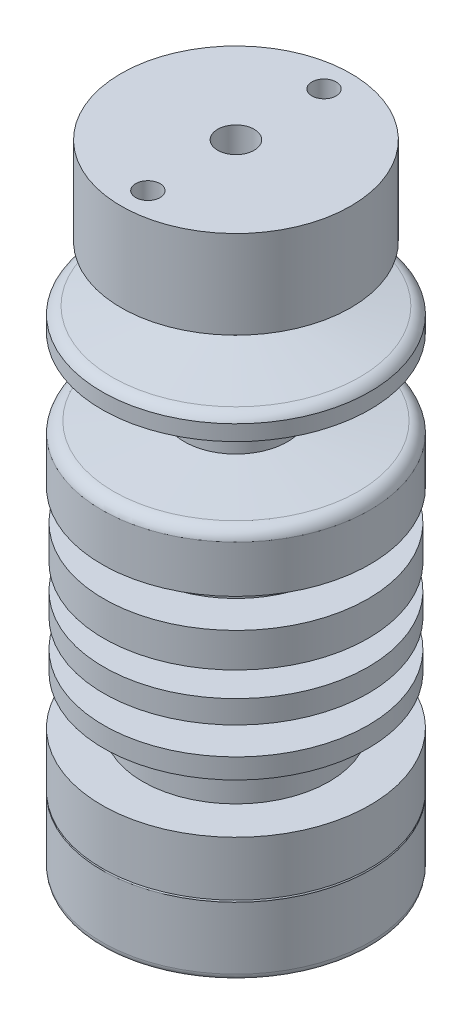
ISO-10303-21;
HEADER;
FILE_DESCRIPTION(('STEP AP214'),'2;1');
FILE_NAME('part.step','',(''),(''),'','','');
FILE_SCHEMA(('AUTOMOTIVE_DESIGN { 1 0 10303 214 1 1 1 1 }'));
ENDSEC;
DATA;
#1=APPLICATION_CONTEXT('core data for automotive mechanical design processes');
#2=APPLICATION_PROTOCOL_DEFINITION('international standard','automotive_design',2000,#1);
#3=PRODUCT_CONTEXT('',#1,'mechanical');
#4=PRODUCT('Part','Part','',(#3));
#5=PRODUCT_RELATED_PRODUCT_CATEGORY('part','',(#4));
#6=PRODUCT_DEFINITION_FORMATION('','',#4);
#7=PRODUCT_DEFINITION_CONTEXT('part definition',#1,'design');
#8=PRODUCT_DEFINITION('design','',#6,#7);
#9=PRODUCT_DEFINITION_SHAPE('','',#8);
#10=(LENGTH_UNIT() NAMED_UNIT(*) SI_UNIT(.MILLI.,.METRE.));
#11=(NAMED_UNIT(*) PLANE_ANGLE_UNIT() SI_UNIT($,.RADIAN.));
#12=(NAMED_UNIT(*) SI_UNIT($,.STERADIAN.) SOLID_ANGLE_UNIT());
#13=UNCERTAINTY_MEASURE_WITH_UNIT(LENGTH_MEASURE(1.E-05),#10,'distance_accuracy_value','');
#14=(GEOMETRIC_REPRESENTATION_CONTEXT(3) GLOBAL_UNCERTAINTY_ASSIGNED_CONTEXT((#13)) GLOBAL_UNIT_ASSIGNED_CONTEXT((#10,
#11,#12)) REPRESENTATION_CONTEXT('',''));
#15=CARTESIAN_POINT('',(0.,0.,0.));
#16=DIRECTION('',(0.,0.,1.));
#17=DIRECTION('',(1.,0.,0.));
#18=AXIS2_PLACEMENT_3D('',#15,#16,#17);
#19=CARTESIAN_POINT('',(0.,43.0445682451364,0.));
#20=DIRECTION('',(0.,-1.,0.));
#21=DIRECTION('',(1.,0.,0.));
#22=AXIS2_PLACEMENT_3D('',#19,#20,#21);
#23=PLANE('',#22);
#24=CARTESIAN_POINT('',(0.,43.0445682451364,0.));
#25=DIRECTION('',(0.,1.,0.));
#26=DIRECTION('',(-1.,0.,0.));
#27=AXIS2_PLACEMENT_3D('',#24,#25,#26);
#28=CIRCLE('',#27,4.765);
#29=CARTESIAN_POINT('',(-4.765,43.0445682451364,0.));
#30=VERTEX_POINT('',#29);
#31=EDGE_CURVE('E65',#30,#30,#28,.T.);
#32=ORIENTED_EDGE('',*,*,#31,.F.);
#33=EDGE_LOOP('',(#32));
#34=FACE_BOUND('',#33,.T.);
#35=CARTESIAN_POINT('',(0.,43.0445682451364,23.));
#36=DIRECTION('',(0.,1.,0.));
#37=DIRECTION('',(-1.,0.,0.));
#38=AXIS2_PLACEMENT_3D('',#35,#36,#37);
#39=CIRCLE('',#38,3.175);
#40=CARTESIAN_POINT('',(-3.17500000000001,43.0445682451364,23.));
#41=VERTEX_POINT('',#40);
#42=EDGE_CURVE('E64',#41,#41,#39,.T.);
#43=ORIENTED_EDGE('',*,*,#42,.F.);
#44=EDGE_LOOP('',(#43));
#45=FACE_BOUND('',#44,.T.);
#46=CARTESIAN_POINT('',(0.,43.0445682451364,-23.));
#47=DIRECTION('',(0.,1.,0.));
#48=DIRECTION('',(-1.,0.,0.));
#49=AXIS2_PLACEMENT_3D('',#46,#47,#48);
#50=CIRCLE('',#49,3.175);
#51=CARTESIAN_POINT('',(-3.17500000000001,43.0445682451364,-23.));
#52=VERTEX_POINT('',#51);
#53=EDGE_CURVE('E71',#52,#52,#50,.T.);
#54=ORIENTED_EDGE('',*,*,#53,.F.);
#55=EDGE_LOOP('',(#54));
#56=FACE_BOUND('',#55,.T.);
#57=CARTESIAN_POINT('',(0.,43.0445682451364,0.));
#58=DIRECTION('',(0.,1.,0.));
#59=DIRECTION('',(-1.,0.,0.));
#60=AXIS2_PLACEMENT_3D('',#57,#58,#59);
#61=CIRCLE('',#60,30.);
#62=CARTESIAN_POINT('',(-30.,43.0445682451364,0.));
#63=VERTEX_POINT('',#62);
#64=EDGE_CURVE('E42',#63,#63,#61,.T.);
#65=ORIENTED_EDGE('',*,*,#64,.T.);
#66=EDGE_LOOP('',(#65));
#67=FACE_BOUND('',#66,.T.);
#68=ADVANCED_FACE('F35',(#34,#45,#56,#67),#23,.F.);
#69=CARTESIAN_POINT('',(0.,43.0445682451364,0.));
#70=DIRECTION('',(0.,1.,0.));
#71=DIRECTION('',(-1.,0.,0.));
#72=AXIS2_PLACEMENT_3D('',#69,#70,#71);
#73=CYLINDRICAL_SURFACE('',#72,30.);
#74=ORIENTED_EDGE('',*,*,#64,.F.);
#75=EDGE_LOOP('',(#74));
#76=FACE_BOUND('',#75,.T.);
#77=CARTESIAN_POINT('',(0.,20.0445682451364,0.));
#78=DIRECTION('',(0.,1.,0.));
#79=DIRECTION('',(-1.,0.,0.));
#80=AXIS2_PLACEMENT_3D('',#77,#78,#79);
#81=CIRCLE('',#80,30.);
#82=CARTESIAN_POINT('',(-30.,20.0445682451364,0.));
#83=VERTEX_POINT('',#82);
#84=EDGE_CURVE('E164',#83,#83,#81,.T.);
#85=ORIENTED_EDGE('',*,*,#84,.T.);
#86=EDGE_LOOP('',(#85));
#87=FACE_BOUND('',#86,.T.);
#88=ADVANCED_FACE('F232',(#76,#87),#73,.T.);
#89=CARTESIAN_POINT('',(30.,20.0445682451364,0.));
#90=DIRECTION('',(0.,1.,0.));
#91=DIRECTION('',(-1.,0.,0.));
#92=AXIS2_PLACEMENT_3D('',#89,#90,#91);
#93=PLANE('',#92);
#94=ORIENTED_EDGE('',*,*,#84,.F.);
#95=EDGE_LOOP('',(#94));
#96=FACE_BOUND('',#95,.T.);
#97=CARTESIAN_POINT('',(0.,20.0445682451364,0.));
#98=DIRECTION('',(0.,1.,0.));
#99=DIRECTION('',(-1.,0.,0.));
#100=AXIS2_PLACEMENT_3D('',#97,#98,#99);
#101=CIRCLE('',#100,12.9857969124329);
#102=CARTESIAN_POINT('',(-12.9857969124329,20.0445682451364,0.));
#103=VERTEX_POINT('',#102);
#104=EDGE_CURVE('E161',#103,#103,#101,.T.);
#105=ORIENTED_EDGE('',*,*,#104,.T.);
#106=EDGE_LOOP('',(#105));
#107=FACE_BOUND('',#106,.T.);
#108=ADVANCED_FACE('F237',(#96,#107),#93,.F.);
#109=CARTESIAN_POINT('',(0.,43.0445682451364,0.));
#110=DIRECTION('',(0.,1.,0.));
#111=DIRECTION('',(-1.,0.,0.));
#112=AXIS2_PLACEMENT_3D('',#109,#110,#111);
#113=CYLINDRICAL_SURFACE('',#112,12.9857969124329);
#114=ORIENTED_EDGE('',*,*,#104,.F.);
#115=EDGE_LOOP('',(#114));
#116=FACE_BOUND('',#115,.T.);
#117=CARTESIAN_POINT('',(0.,10.4062076007876,0.));
#118=DIRECTION('',(0.,1.,0.));
#119=DIRECTION('',(-1.,0.,0.));
#120=AXIS2_PLACEMENT_3D('',#117,#118,#119);
#121=CIRCLE('',#120,12.9857969124329);
#122=CARTESIAN_POINT('',(-12.9857969124329,10.4062076007876,0.));
#123=VERTEX_POINT('',#122);
#124=EDGE_CURVE('E158',#123,#123,#121,.T.);
#125=ORIENTED_EDGE('',*,*,#124,.T.);
#126=EDGE_LOOP('',(#125));
#127=FACE_BOUND('',#126,.T.);
#128=ADVANCED_FACE('F251',(#116,#127),#113,.T.);
#129=CARTESIAN_POINT('',(0.,10.4062076007876,0.));
#130=DIRECTION('',(0.,1.,0.));
#131=DIRECTION('',(-1.,0.,0.));
#132=AXIS2_PLACEMENT_3D('',#129,#130,#131);
#133=TOROIDAL_SURFACE('',#132,15.8008154382432,2.81501852581031);
#134=ORIENTED_EDGE('',*,*,#124,.F.);
#135=EDGE_LOOP('',(#134));
#136=FACE_BOUND('',#135,.T.);
#137=CARTESIAN_POINT('',(0.,8.51251271153448,0.));
#138=DIRECTION('',(0.,1.,0.));
#139=DIRECTION('',(-1.,0.,0.));
#140=AXIS2_PLACEMENT_3D('',#137,#138,#139);
#141=CIRCLE('',#140,13.7179690763931);
#142=CARTESIAN_POINT('',(-13.7179690763931,8.51251271153447,0.));
#143=VERTEX_POINT('',#142);
#144=EDGE_CURVE('E155',#143,#143,#141,.T.);
#145=ORIENTED_EDGE('',*,*,#144,.T.);
#146=EDGE_LOOP('',(#145));
#147=FACE_BOUND('',#146,.T.);
#148=ADVANCED_FACE('F257',(#136,#147),#133,.F.);
#149=CARTESIAN_POINT('',(0.,5.48596194522862,0.));
#150=DIRECTION('',(0.,-1.,0.));
#151=DIRECTION('',(1.,0.,0.));
#152=AXIS2_PLACEMENT_3D('',#149,#150,#151);
#153=CONICAL_SURFACE('',#152,32.3097448153254,1.40942212691776);
#154=ORIENTED_EDGE('',*,*,#144,.F.);
#155=EDGE_LOOP('',(#154));
#156=FACE_BOUND('',#155,.T.);
#157=CARTESIAN_POINT('',(0.,5.48596194522862,0.));
#158=DIRECTION('',(0.,1.,0.));
#159=DIRECTION('',(-1.,0.,0.));
#160=AXIS2_PLACEMENT_3D('',#157,#158,#159);
#161=CIRCLE('',#160,32.3097448153254);
#162=CARTESIAN_POINT('',(-32.3097448153254,5.48596194522862,0.));
#163=VERTEX_POINT('',#162);
#164=EDGE_CURVE('E152',#163,#163,#161,.T.);
#165=ORIENTED_EDGE('',*,*,#164,.T.);
#166=EDGE_LOOP('',(#165));
#167=FACE_BOUND('',#166,.T.);
#168=ADVANCED_FACE('F263',(#156,#167),#153,.T.);
#169=CARTESIAN_POINT('',(0.,1.82897337850735,0.));
#170=DIRECTION('',(0.,1.,0.));
#171=DIRECTION('',(-1.,0.,0.));
#172=AXIS2_PLACEMENT_3D('',#169,#170,#171);
#173=TOROIDAL_SURFACE('',#172,31.714424513252,3.7051277493753);
#174=ORIENTED_EDGE('',*,*,#164,.F.);
#175=EDGE_LOOP('',(#174));
#176=FACE_BOUND('',#175,.T.);
#177=CARTESIAN_POINT('',(0.,3.54156362724511,0.));
#178=DIRECTION('',(0.,1.,0.));
#179=DIRECTION('',(-1.,0.,0.));
#180=AXIS2_PLACEMENT_3D('',#177,#178,#179);
#181=CIRCLE('',#180,35.);
#182=CARTESIAN_POINT('',(-35.,3.54156362724511,0.));
#183=VERTEX_POINT('',#182);
#184=EDGE_CURVE('E149',#183,#183,#181,.T.);
#185=ORIENTED_EDGE('',*,*,#184,.T.);
#186=EDGE_LOOP('',(#185));
#187=FACE_BOUND('',#186,.T.);
#188=ADVANCED_FACE('F269',(#176,#187),#173,.T.);
#189=CARTESIAN_POINT('',(0.,43.0445682451364,0.));
#190=DIRECTION('',(0.,1.,0.));
#191=DIRECTION('',(-1.,0.,0.));
#192=AXIS2_PLACEMENT_3D('',#189,#190,#191);
#193=CYLINDRICAL_SURFACE('',#192,35.);
#194=ORIENTED_EDGE('',*,*,#184,.F.);
#195=EDGE_LOOP('',(#194));
#196=FACE_BOUND('',#195,.T.);
#197=CARTESIAN_POINT('',(0.,-0.490098714239634,0.));
#198=DIRECTION('',(0.,1.,0.));
#199=DIRECTION('',(-1.,0.,0.));
#200=AXIS2_PLACEMENT_3D('',#197,#198,#199);
#201=CIRCLE('',#200,35.);
#202=CARTESIAN_POINT('',(-35.,-0.490098714239638,0.));
#203=VERTEX_POINT('',#202);
#204=EDGE_CURVE('E146',#203,#203,#201,.T.);
#205=ORIENTED_EDGE('',*,*,#204,.T.);
#206=EDGE_LOOP('',(#205));
#207=FACE_BOUND('',#206,.T.);
#208=ADVANCED_FACE('F275',(#196,#207),#193,.T.);
#209=CARTESIAN_POINT('',(13.4687354882585,-0.490098714239631,0.));
#210=DIRECTION('',(0.,1.,0.));
#211=DIRECTION('',(-1.,0.,0.));
#212=AXIS2_PLACEMENT_3D('',#209,#210,#211);
#213=PLANE('',#212);
#214=ORIENTED_EDGE('',*,*,#204,.F.);
#215=EDGE_LOOP('',(#214));
#216=FACE_BOUND('',#215,.T.);
#217=CARTESIAN_POINT('',(0.,-0.490098714239634,0.));
#218=DIRECTION('',(0.,1.,0.));
#219=DIRECTION('',(-1.,0.,0.));
#220=AXIS2_PLACEMENT_3D('',#217,#218,#219);
#221=CIRCLE('',#220,13.4687354882585);
#222=CARTESIAN_POINT('',(-13.4687354882585,-0.490098714239636,0.));
#223=VERTEX_POINT('',#222);
#224=EDGE_CURVE('E143',#223,#223,#221,.T.);
#225=ORIENTED_EDGE('',*,*,#224,.T.);
#226=EDGE_LOOP('',(#225));
#227=FACE_BOUND('',#226,.T.);
#228=ADVANCED_FACE('F281',(#216,#227),#213,.F.);
#229=CARTESIAN_POINT('',(0.,43.0445682451364,0.));
#230=DIRECTION('',(0.,1.,0.));
#231=DIRECTION('',(-1.,0.,0.));
#232=AXIS2_PLACEMENT_3D('',#229,#230,#231);
#233=CYLINDRICAL_SURFACE('',#232,13.4687354882585);
#234=ORIENTED_EDGE('',*,*,#224,.F.);
#235=EDGE_LOOP('',(#234));
#236=FACE_BOUND('',#235,.T.);
#237=CARTESIAN_POINT('',(0.,-18.538757945872,0.));
#238=DIRECTION('',(0.,1.,0.));
#239=DIRECTION('',(-1.,0.,0.));
#240=AXIS2_PLACEMENT_3D('',#237,#238,#239);
#241=CIRCLE('',#240,13.4687354882585);
#242=CARTESIAN_POINT('',(-13.4687354882585,-18.538757945872,0.));
#243=VERTEX_POINT('',#242);
#244=EDGE_CURVE('E140',#243,#243,#241,.T.);
#245=ORIENTED_EDGE('',*,*,#244,.T.);
#246=EDGE_LOOP('',(#245));
#247=FACE_BOUND('',#246,.T.);
#248=ADVANCED_FACE('F287',(#236,#247),#233,.T.);
#249=CARTESIAN_POINT('',(0.,-20.5131962872159,0.));
#250=DIRECTION('',(0.,-1.,0.));
#251=DIRECTION('',(1.,0.,0.));
#252=AXIS2_PLACEMENT_3D('',#249,#250,#251);
#253=CONICAL_SURFACE('',#252,31.9792266270137,1.46453221422253);
#254=ORIENTED_EDGE('',*,*,#244,.F.);
#255=EDGE_LOOP('',(#254));
#256=FACE_BOUND('',#255,.T.);
#257=CARTESIAN_POINT('',(0.,-20.5131962872159,0.));
#258=DIRECTION('',(0.,1.,0.));
#259=DIRECTION('',(-1.,0.,0.));
#260=AXIS2_PLACEMENT_3D('',#257,#258,#259);
#261=CIRCLE('',#260,31.9792266270137);
#262=CARTESIAN_POINT('',(-31.9792266270137,-20.5131962872159,0.));
#263=VERTEX_POINT('',#262);
#264=EDGE_CURVE('E137',#263,#263,#261,.T.);
#265=ORIENTED_EDGE('',*,*,#264,.T.);
#266=EDGE_LOOP('',(#265));
#267=FACE_BOUND('',#266,.T.);
#268=ADVANCED_FACE('F293',(#256,#267),#253,.T.);
#269=CARTESIAN_POINT('',(0.,-23.9615059492109,0.));
#270=DIRECTION('',(0.,1.,0.));
#271=DIRECTION('',(-1.,0.,0.));
#272=AXIS2_PLACEMENT_3D('',#269,#270,#271);
#273=TOROIDAL_SURFACE('',#272,31.6114095465033,3.46787095055789);
#274=ORIENTED_EDGE('',*,*,#264,.F.);
#275=EDGE_LOOP('',(#274));
#276=FACE_BOUND('',#275,.T.);
#277=CARTESIAN_POINT('',(0.,-23.2242246811764,0.));
#278=DIRECTION('',(0.,1.,0.));
#279=DIRECTION('',(-1.,0.,0.));
#280=AXIS2_PLACEMENT_3D('',#277,#278,#279);
#281=CIRCLE('',#280,35.);
#282=CARTESIAN_POINT('',(-35.,-23.2242246811764,0.));
#283=VERTEX_POINT('',#282);
#284=EDGE_CURVE('E134',#283,#283,#281,.T.);
#285=ORIENTED_EDGE('',*,*,#284,.T.);
#286=EDGE_LOOP('',(#285));
#287=FACE_BOUND('',#286,.T.);
#288=ADVANCED_FACE('F299',(#276,#287),#273,.T.);
#289=CARTESIAN_POINT('',(0.,43.0445682451364,0.));
#290=DIRECTION('',(0.,1.,0.));
#291=DIRECTION('',(-1.,0.,0.));
#292=AXIS2_PLACEMENT_3D('',#289,#290,#291);
#293=CYLINDRICAL_SURFACE('',#292,35.);
#294=ORIENTED_EDGE('',*,*,#284,.F.);
#295=EDGE_LOOP('',(#294));
#296=FACE_BOUND('',#295,.T.);
#297=CARTESIAN_POINT('',(0.,-35.501069654203,0.));
#298=DIRECTION('',(0.,1.,0.));
#299=DIRECTION('',(-1.,0.,0.));
#300=AXIS2_PLACEMENT_3D('',#297,#298,#299);
#301=CIRCLE('',#300,35.);
#302=CARTESIAN_POINT('',(-35.,-35.501069654203,0.));
#303=VERTEX_POINT('',#302);
#304=EDGE_CURVE('E131',#303,#303,#301,.T.);
#305=ORIENTED_EDGE('',*,*,#304,.T.);
#306=EDGE_LOOP('',(#305));
#307=FACE_BOUND('',#306,.T.);
#308=ADVANCED_FACE('F305',(#296,#307),#293,.T.);
#309=CARTESIAN_POINT('',(35.,-35.501069654203,0.));
#310=DIRECTION('',(0.,1.,0.));
#311=DIRECTION('',(-1.,0.,0.));
#312=AXIS2_PLACEMENT_3D('',#309,#310,#311);
#313=PLANE('',#312);
#314=ORIENTED_EDGE('',*,*,#304,.F.);
#315=EDGE_LOOP('',(#314));
#316=FACE_BOUND('',#315,.T.);
#317=CARTESIAN_POINT('',(0.,-35.501069654203,0.));
#318=DIRECTION('',(0.,1.,0.));
#319=DIRECTION('',(-1.,0.,0.));
#320=AXIS2_PLACEMENT_3D('',#317,#318,#319);
#321=CIRCLE('',#320,24.3346955919766);
#322=CARTESIAN_POINT('',(-24.3346955919766,-35.501069654203,0.));
#323=VERTEX_POINT('',#322);
#324=EDGE_CURVE('E128',#323,#323,#321,.T.);
#325=ORIENTED_EDGE('',*,*,#324,.T.);
#326=EDGE_LOOP('',(#325));
#327=FACE_BOUND('',#326,.T.);
#328=ADVANCED_FACE('F311',(#316,#327),#313,.F.);
#329=CARTESIAN_POINT('',(0.,43.0445682451364,0.));
#330=DIRECTION('',(0.,1.,0.));
#331=DIRECTION('',(-1.,0.,0.));
#332=AXIS2_PLACEMENT_3D('',#329,#330,#331);
#333=CYLINDRICAL_SURFACE('',#332,24.3346955919766);
#334=ORIENTED_EDGE('',*,*,#324,.F.);
#335=EDGE_LOOP('',(#334));
#336=FACE_BOUND('',#335,.T.);
#337=CARTESIAN_POINT('',(0.,-43.5201302921998,0.));
#338=DIRECTION('',(0.,1.,0.));
#339=DIRECTION('',(-1.,0.,0.));
#340=AXIS2_PLACEMENT_3D('',#337,#338,#339);
#341=CIRCLE('',#340,24.3346955919766);
#342=CARTESIAN_POINT('',(-24.3346955919766,-43.5201302921998,0.));
#343=VERTEX_POINT('',#342);
#344=EDGE_CURVE('E125',#343,#343,#341,.T.);
#345=ORIENTED_EDGE('',*,*,#344,.T.);
#346=EDGE_LOOP('',(#345));
#347=FACE_BOUND('',#346,.T.);
#348=ADVANCED_FACE('F317',(#336,#347),#333,.T.);
#349=CARTESIAN_POINT('',(34.5383420831025,-43.5201302921998,0.));
#350=DIRECTION('',(0.,-1.,0.));
#351=DIRECTION('',(1.,0.,0.));
#352=AXIS2_PLACEMENT_3D('',#349,#350,#351);
#353=PLANE('',#352);
#354=ORIENTED_EDGE('',*,*,#344,.F.);
#355=EDGE_LOOP('',(#354));
#356=FACE_BOUND('',#355,.T.);
#357=CARTESIAN_POINT('',(0.,-43.5201302921998,0.));
#358=DIRECTION('',(0.,1.,0.));
#359=DIRECTION('',(-1.,0.,0.));
#360=AXIS2_PLACEMENT_3D('',#357,#358,#359);
#361=CIRCLE('',#360,34.5383420831025);
#362=CARTESIAN_POINT('',(-34.5383420831025,-43.5201302921998,0.));
#363=VERTEX_POINT('',#362);
#364=EDGE_CURVE('E122',#363,#363,#361,.T.);
#365=ORIENTED_EDGE('',*,*,#364,.T.);
#366=EDGE_LOOP('',(#365));
#367=FACE_BOUND('',#366,.T.);
#368=ADVANCED_FACE('F323',(#356,#367),#353,.F.);
#369=CARTESIAN_POINT('',(0.,43.0445682451364,0.));
#370=DIRECTION('',(0.,1.,0.));
#371=DIRECTION('',(-1.,0.,0.));
#372=AXIS2_PLACEMENT_3D('',#369,#370,#371);
#373=CYLINDRICAL_SURFACE('',#372,34.5383420831025);
#374=ORIENTED_EDGE('',*,*,#364,.F.);
#375=EDGE_LOOP('',(#374));
#376=FACE_BOUND('',#375,.T.);
#377=CARTESIAN_POINT('',(0.,-52.4771427984482,0.));
#378=DIRECTION('',(0.,1.,0.));
#379=DIRECTION('',(-1.,0.,0.));
#380=AXIS2_PLACEMENT_3D('',#377,#378,#379);
#381=CIRCLE('',#380,34.5383420831025);
#382=CARTESIAN_POINT('',(-34.5383420831025,-52.4771427984482,0.));
#383=VERTEX_POINT('',#382);
#384=EDGE_CURVE('E119',#383,#383,#381,.T.);
#385=ORIENTED_EDGE('',*,*,#384,.T.);
#386=EDGE_LOOP('',(#385));
#387=FACE_BOUND('',#386,.T.);
#388=ADVANCED_FACE('F329',(#376,#387),#373,.T.);
#389=CARTESIAN_POINT('',(24.3346955919766,-52.4771427984482,0.));
#390=DIRECTION('',(0.,1.,0.));
#391=DIRECTION('',(-1.,0.,0.));
#392=AXIS2_PLACEMENT_3D('',#389,#390,#391);
#393=PLANE('',#392);
#394=ORIENTED_EDGE('',*,*,#384,.F.);
#395=EDGE_LOOP('',(#394));
#396=FACE_BOUND('',#395,.T.);
#397=CARTESIAN_POINT('',(0.,-52.4771427984482,0.));
#398=DIRECTION('',(0.,1.,0.));
#399=DIRECTION('',(-1.,0.,0.));
#400=AXIS2_PLACEMENT_3D('',#397,#398,#399);
#401=CIRCLE('',#400,24.3346955919766);
#402=CARTESIAN_POINT('',(-24.3346955919766,-52.4771427984482,0.));
#403=VERTEX_POINT('',#402);
#404=EDGE_CURVE('E116',#403,#403,#401,.T.);
#405=ORIENTED_EDGE('',*,*,#404,.T.);
#406=EDGE_LOOP('',(#405));
#407=FACE_BOUND('',#406,.T.);
#408=ADVANCED_FACE('F335',(#396,#407),#393,.F.);
#409=CARTESIAN_POINT('',(0.,43.0445682451364,0.));
#410=DIRECTION('',(0.,1.,0.));
#411=DIRECTION('',(-1.,0.,0.));
#412=AXIS2_PLACEMENT_3D('',#409,#410,#411);
#413=CYLINDRICAL_SURFACE('',#412,24.3346955919766);
#414=ORIENTED_EDGE('',*,*,#404,.F.);
#415=EDGE_LOOP('',(#414));
#416=FACE_BOUND('',#415,.T.);
#417=CARTESIAN_POINT('',(0.,-58.9460962751831,0.));
#418=DIRECTION('',(0.,1.,0.));
#419=DIRECTION('',(-1.,0.,0.));
#420=AXIS2_PLACEMENT_3D('',#417,#418,#419);
#421=CIRCLE('',#420,24.3346955919766);
#422=CARTESIAN_POINT('',(-24.3346955919766,-58.9460962751831,0.));
#423=VERTEX_POINT('',#422);
#424=EDGE_CURVE('E113',#423,#423,#421,.T.);
#425=ORIENTED_EDGE('',*,*,#424,.T.);
#426=EDGE_LOOP('',(#425));
#427=FACE_BOUND('',#426,.T.);
#428=ADVANCED_FACE('F341',(#416,#427),#413,.T.);
#429=CARTESIAN_POINT('',(34.5383420831025,-58.9460962751831,0.));
#430=DIRECTION('',(0.,-1.,0.));
#431=DIRECTION('',(1.,0.,0.));
#432=AXIS2_PLACEMENT_3D('',#429,#430,#431);
#433=PLANE('',#432);
#434=ORIENTED_EDGE('',*,*,#424,.F.);
#435=EDGE_LOOP('',(#434));
#436=FACE_BOUND('',#435,.T.);
#437=CARTESIAN_POINT('',(0.,-58.9460962751831,0.));
#438=DIRECTION('',(0.,1.,0.));
#439=DIRECTION('',(-1.,0.,0.));
#440=AXIS2_PLACEMENT_3D('',#437,#438,#439);
#441=CIRCLE('',#440,34.5383420831025);
#442=CARTESIAN_POINT('',(-34.5383420831025,-58.9460962751831,0.));
#443=VERTEX_POINT('',#442);
#444=EDGE_CURVE('E110',#443,#443,#441,.T.);
#445=ORIENTED_EDGE('',*,*,#444,.T.);
#446=EDGE_LOOP('',(#445));
#447=FACE_BOUND('',#446,.T.);
#448=ADVANCED_FACE('F347',(#436,#447),#433,.F.);
#449=CARTESIAN_POINT('',(0.,43.0445682451364,0.));
#450=DIRECTION('',(0.,1.,0.));
#451=DIRECTION('',(-1.,0.,0.));
#452=AXIS2_PLACEMENT_3D('',#449,#450,#451);
#453=CYLINDRICAL_SURFACE('',#452,34.5383420831025);
#454=ORIENTED_EDGE('',*,*,#444,.F.);
#455=EDGE_LOOP('',(#454));
#456=FACE_BOUND('',#455,.T.);
#457=CARTESIAN_POINT('',(0.,-64.9174379460154,0.));
#458=DIRECTION('',(0.,1.,0.));
#459=DIRECTION('',(-1.,0.,0.));
#460=AXIS2_PLACEMENT_3D('',#457,#458,#459);
#461=CIRCLE('',#460,34.5383420831025);
#462=CARTESIAN_POINT('',(-34.5383420831025,-64.9174379460154,0.));
#463=VERTEX_POINT('',#462);
#464=EDGE_CURVE('E107',#463,#463,#461,.T.);
#465=ORIENTED_EDGE('',*,*,#464,.T.);
#466=EDGE_LOOP('',(#465));
#467=FACE_BOUND('',#466,.T.);
#468=ADVANCED_FACE('F353',(#456,#467),#453,.T.);
#469=CARTESIAN_POINT('',(24.3346955919766,-64.9174379460154,0.));
#470=DIRECTION('',(0.,1.,0.));
#471=DIRECTION('',(-1.,0.,0.));
#472=AXIS2_PLACEMENT_3D('',#469,#470,#471);
#473=PLANE('',#472);
#474=ORIENTED_EDGE('',*,*,#464,.F.);
#475=EDGE_LOOP('',(#474));
#476=FACE_BOUND('',#475,.T.);
#477=CARTESIAN_POINT('',(0.,-64.9174379460154,0.));
#478=DIRECTION('',(0.,1.,0.));
#479=DIRECTION('',(-1.,0.,0.));
#480=AXIS2_PLACEMENT_3D('',#477,#478,#479);
#481=CIRCLE('',#480,24.3346955919766);
#482=CARTESIAN_POINT('',(-24.3346955919766,-64.9174379460154,0.));
#483=VERTEX_POINT('',#482);
#484=EDGE_CURVE('E104',#483,#483,#481,.T.);
#485=ORIENTED_EDGE('',*,*,#484,.T.);
#486=EDGE_LOOP('',(#485));
#487=FACE_BOUND('',#486,.T.);
#488=ADVANCED_FACE('F359',(#476,#487),#473,.F.);
#489=CARTESIAN_POINT('',(0.,43.0445682451364,0.));
#490=DIRECTION('',(0.,1.,0.));
#491=DIRECTION('',(-1.,0.,0.));
#492=AXIS2_PLACEMENT_3D('',#489,#490,#491);
#493=CYLINDRICAL_SURFACE('',#492,24.3346955919766);
#494=ORIENTED_EDGE('',*,*,#484,.F.);
#495=EDGE_LOOP('',(#494));
#496=FACE_BOUND('',#495,.T.);
#497=CARTESIAN_POINT('',(0.,-72.1328091316043,0.));
#498=DIRECTION('',(0.,1.,0.));
#499=DIRECTION('',(-1.,0.,0.));
#500=AXIS2_PLACEMENT_3D('',#497,#498,#499);
#501=CIRCLE('',#500,24.3346955919766);
#502=CARTESIAN_POINT('',(-24.3346955919766,-72.1328091316043,0.));
#503=VERTEX_POINT('',#502);
#504=EDGE_CURVE('E101',#503,#503,#501,.T.);
#505=ORIENTED_EDGE('',*,*,#504,.T.);
#506=EDGE_LOOP('',(#505));
#507=FACE_BOUND('',#506,.T.);
#508=ADVANCED_FACE('F365',(#496,#507),#493,.T.);
#509=CARTESIAN_POINT('',(34.5383420831025,-72.1328091316043,0.));
#510=DIRECTION('',(0.,-1.,0.));
#511=DIRECTION('',(1.,0.,0.));
#512=AXIS2_PLACEMENT_3D('',#509,#510,#511);
#513=PLANE('',#512);
#514=ORIENTED_EDGE('',*,*,#504,.F.);
#515=EDGE_LOOP('',(#514));
#516=FACE_BOUND('',#515,.T.);
#517=CARTESIAN_POINT('',(0.,-72.1328091316043,0.));
#518=DIRECTION('',(0.,1.,0.));
#519=DIRECTION('',(-1.,0.,0.));
#520=AXIS2_PLACEMENT_3D('',#517,#518,#519);
#521=CIRCLE('',#520,34.5383420831025);
#522=CARTESIAN_POINT('',(-34.5383420831025,-72.1328091316043,0.));
#523=VERTEX_POINT('',#522);
#524=EDGE_CURVE('E98',#523,#523,#521,.T.);
#525=ORIENTED_EDGE('',*,*,#524,.T.);
#526=EDGE_LOOP('',(#525));
#527=FACE_BOUND('',#526,.T.);
#528=ADVANCED_FACE('F371',(#516,#527),#513,.F.);
#529=CARTESIAN_POINT('',(0.,43.0445682451364,0.));
#530=DIRECTION('',(0.,1.,0.));
#531=DIRECTION('',(-1.,0.,0.));
#532=AXIS2_PLACEMENT_3D('',#529,#530,#531);
#533=CYLINDRICAL_SURFACE('',#532,34.5383420831025);
#534=ORIENTED_EDGE('',*,*,#524,.F.);
#535=EDGE_LOOP('',(#534));
#536=FACE_BOUND('',#535,.T.);
#537=CARTESIAN_POINT('',(0.,-77.3577330935826,0.));
#538=DIRECTION('',(0.,1.,0.));
#539=DIRECTION('',(-1.,0.,0.));
#540=AXIS2_PLACEMENT_3D('',#537,#538,#539);
#541=CIRCLE('',#540,34.5383420831025);
#542=CARTESIAN_POINT('',(-34.5383420831025,-77.3577330935826,0.));
#543=VERTEX_POINT('',#542);
#544=EDGE_CURVE('E95',#543,#543,#541,.T.);
#545=ORIENTED_EDGE('',*,*,#544,.T.);
#546=EDGE_LOOP('',(#545));
#547=FACE_BOUND('',#546,.T.);
#548=ADVANCED_FACE('F377',(#536,#547),#533,.T.);
#549=CARTESIAN_POINT('',(24.3346955919766,-77.3577330935826,0.));
#550=DIRECTION('',(0.,1.,0.));
#551=DIRECTION('',(-1.,0.,0.));
#552=AXIS2_PLACEMENT_3D('',#549,#550,#551);
#553=PLANE('',#552);
#554=ORIENTED_EDGE('',*,*,#544,.F.);
#555=EDGE_LOOP('',(#554));
#556=FACE_BOUND('',#555,.T.);
#557=CARTESIAN_POINT('',(0.,-77.3577330935826,0.));
#558=DIRECTION('',(0.,1.,0.));
#559=DIRECTION('',(-1.,0.,0.));
#560=AXIS2_PLACEMENT_3D('',#557,#558,#559);
#561=CIRCLE('',#560,24.3346955919766);
#562=CARTESIAN_POINT('',(-24.3346955919766,-77.3577330935826,0.));
#563=VERTEX_POINT('',#562);
#564=EDGE_CURVE('E92',#563,#563,#561,.T.);
#565=ORIENTED_EDGE('',*,*,#564,.T.);
#566=EDGE_LOOP('',(#565));
#567=FACE_BOUND('',#566,.T.);
#568=ADVANCED_FACE('F383',(#556,#567),#553,.F.);
#569=CARTESIAN_POINT('',(0.,43.0445682451364,0.));
#570=DIRECTION('',(0.,1.,0.));
#571=DIRECTION('',(-1.,0.,0.));
#572=AXIS2_PLACEMENT_3D('',#569,#570,#571);
#573=CYLINDRICAL_SURFACE('',#572,24.3346955919766);
#574=CARTESIAN_POINT('',(0.,-89.9816680736034,0.));
#575=DIRECTION('',(0.,1.,0.));
#576=DIRECTION('',(-1.,0.,0.));
#577=AXIS2_PLACEMENT_3D('',#574,#575,#576);
#578=CIRCLE('',#577,24.3346955919766);
#579=CARTESIAN_POINT('',(-24.3346955919766,-89.9816680736034,0.));
#580=VERTEX_POINT('',#579);
#581=EDGE_CURVE('E38',#580,#580,#578,.T.);
#582=ORIENTED_EDGE('',*,*,#581,.T.);
#583=EDGE_LOOP('',(#582));
#584=FACE_BOUND('',#583,.T.);
#585=ORIENTED_EDGE('',*,*,#564,.F.);
#586=EDGE_LOOP('',(#585));
#587=FACE_BOUND('',#586,.T.);
#588=ADVANCED_FACE('F187',(#584,#587),#573,.T.);
#589=CARTESIAN_POINT('',(0.,25.0445682451364,-23.));
#590=DIRECTION('',(0.,1.,0.));
#591=DIRECTION('',(-1.,0.,0.));
#592=AXIS2_PLACEMENT_3D('',#589,#590,#591);
#593=CYLINDRICAL_SURFACE('',#592,3.175);
#594=CARTESIAN_POINT('',(0.,25.0445682451364,-23.));
#595=DIRECTION('',(0.,1.,0.));
#596=DIRECTION('',(-1.,0.,0.));
#597=AXIS2_PLACEMENT_3D('',#594,#595,#596);
#598=CIRCLE('',#597,3.175);
#599=CARTESIAN_POINT('',(-3.175,25.0445682451364,-23.));
#600=VERTEX_POINT('',#599);
#601=EDGE_CURVE('E74',#600,#600,#598,.T.);
#602=ORIENTED_EDGE('',*,*,#601,.F.);
#603=EDGE_LOOP('',(#602));
#604=FACE_BOUND('',#603,.T.);
#605=ORIENTED_EDGE('',*,*,#53,.T.);
#606=EDGE_LOOP('',(#605));
#607=FACE_BOUND('',#606,.T.);
#608=ADVANCED_FACE('F183',(#604,#607),#593,.F.);
#609=CARTESIAN_POINT('',(0.,25.0445682451364,-23.));
#610=DIRECTION('',(0.,1.,0.));
#611=DIRECTION('',(-1.,0.,0.));
#612=AXIS2_PLACEMENT_3D('',#609,#610,#611);
#613=PLANE('',#612);
#614=ORIENTED_EDGE('',*,*,#601,.T.);
#615=EDGE_LOOP('',(#614));
#616=FACE_BOUND('',#615,.T.);
#617=ADVANCED_FACE('F186',(#616),#613,.T.);
#618=CARTESIAN_POINT('',(0.,25.0445682451364,23.));
#619=DIRECTION('',(0.,1.,0.));
#620=DIRECTION('',(-1.,0.,0.));
#621=AXIS2_PLACEMENT_3D('',#618,#619,#620);
#622=CYLINDRICAL_SURFACE('',#621,3.175);
#623=CARTESIAN_POINT('',(0.,25.0445682451364,23.));
#624=DIRECTION('',(0.,1.,0.));
#625=DIRECTION('',(-1.,0.,0.));
#626=AXIS2_PLACEMENT_3D('',#623,#624,#625);
#627=CIRCLE('',#626,3.175);
#628=CARTESIAN_POINT('',(-3.175,25.0445682451364,23.));
#629=VERTEX_POINT('',#628);
#630=EDGE_CURVE('E68',#629,#629,#627,.T.);
#631=ORIENTED_EDGE('',*,*,#630,.F.);
#632=EDGE_LOOP('',(#631));
#633=FACE_BOUND('',#632,.T.);
#634=ORIENTED_EDGE('',*,*,#42,.T.);
#635=EDGE_LOOP('',(#634));
#636=FACE_BOUND('',#635,.T.);
#637=ADVANCED_FACE('F191',(#633,#636),#622,.F.);
#638=CARTESIAN_POINT('',(0.,25.0445682451364,23.));
#639=DIRECTION('',(0.,1.,0.));
#640=DIRECTION('',(-1.,0.,0.));
#641=AXIS2_PLACEMENT_3D('',#638,#639,#640);
#642=PLANE('',#641);
#643=ORIENTED_EDGE('',*,*,#630,.T.);
#644=EDGE_LOOP('',(#643));
#645=FACE_BOUND('',#644,.T.);
#646=ADVANCED_FACE('F195',(#645),#642,.T.);
#647=CARTESIAN_POINT('',(0.,8.04456824513636,0.));
#648=DIRECTION('',(0.,1.,0.));
#649=DIRECTION('',(-1.,0.,0.));
#650=AXIS2_PLACEMENT_3D('',#647,#648,#649);
#651=CYLINDRICAL_SURFACE('',#650,4.765);
#652=CARTESIAN_POINT('',(0.,8.04456824513636,0.));
#653=DIRECTION('',(0.,1.,0.));
#654=DIRECTION('',(-1.,0.,0.));
#655=AXIS2_PLACEMENT_3D('',#652,#653,#654);
#656=CIRCLE('',#655,4.765);
#657=CARTESIAN_POINT('',(-4.765,8.04456824513636,0.));
#658=VERTEX_POINT('',#657);
#659=EDGE_CURVE('E61',#658,#658,#656,.T.);
#660=ORIENTED_EDGE('',*,*,#659,.F.);
#661=EDGE_LOOP('',(#660));
#662=FACE_BOUND('',#661,.T.);
#663=ORIENTED_EDGE('',*,*,#31,.T.);
#664=EDGE_LOOP('',(#663));
#665=FACE_BOUND('',#664,.T.);
#666=ADVANCED_FACE('F199',(#662,#665),#651,.F.);
#667=CARTESIAN_POINT('',(0.,8.04456824513636,0.));
#668=DIRECTION('',(0.,1.,0.));
#669=DIRECTION('',(-1.,0.,0.));
#670=AXIS2_PLACEMENT_3D('',#667,#668,#669);
#671=PLANE('',#670);
#672=ORIENTED_EDGE('',*,*,#659,.T.);
#673=EDGE_LOOP('',(#672));
#674=FACE_BOUND('',#673,.T.);
#675=ADVANCED_FACE('F203',(#674),#671,.T.);
#676=CARTESIAN_POINT('',(0.,-104.221668073603,0.));
#677=DIRECTION('',(0.,1.,0.));
#678=DIRECTION('',(-1.,0.,0.));
#679=AXIS2_PLACEMENT_3D('',#676,#677,#678);
#680=PLANE('',#679);
#681=CARTESIAN_POINT('',(0.,-104.221668073603,0.));
#682=DIRECTION('',(0.,1.,0.));
#683=DIRECTION('',(-1.,0.,0.));
#684=AXIS2_PLACEMENT_3D('',#681,#682,#683);
#685=CIRCLE('',#684,35.);
#686=CARTESIAN_POINT('',(-35.,-104.221668073603,0.));
#687=VERTEX_POINT('',#686);
#688=EDGE_CURVE('E53',#687,#687,#685,.T.);
#689=ORIENTED_EDGE('',*,*,#688,.F.);
#690=EDGE_LOOP('',(#689));
#691=FACE_BOUND('',#690,.T.);
#692=CARTESIAN_POINT('',(0.,-104.221668073603,0.));
#693=DIRECTION('',(0.,1.,0.));
#694=DIRECTION('',(-1.,0.,0.));
#695=AXIS2_PLACEMENT_3D('',#692,#693,#694);
#696=CIRCLE('',#695,34.5383420831025);
#697=CARTESIAN_POINT('',(-34.5383420831024,-104.221668073603,0.));
#698=VERTEX_POINT('',#697);
#699=EDGE_CURVE('E89',#698,#698,#696,.T.);
#700=ORIENTED_EDGE('',*,*,#699,.T.);
#701=EDGE_LOOP('',(#700));
#702=FACE_BOUND('',#701,.T.);
#703=ADVANCED_FACE('F207',(#691,#702),#680,.F.);
#704=CARTESIAN_POINT('',(0.,-89.9816680736034,0.));
#705=DIRECTION('',(0.,-1.,0.));
#706=DIRECTION('',(1.,0.,0.));
#707=AXIS2_PLACEMENT_3D('',#704,#705,#706);
#708=CYLINDRICAL_SURFACE('',#707,35.);
#709=CARTESIAN_POINT('',(0.,-89.9816680736034,0.));
#710=DIRECTION('',(0.,1.,0.));
#711=DIRECTION('',(-1.,0.,0.));
#712=AXIS2_PLACEMENT_3D('',#709,#710,#711);
#713=CIRCLE('',#712,35.);
#714=CARTESIAN_POINT('',(-35.,-89.9816680736034,0.));
#715=VERTEX_POINT('',#714);
#716=EDGE_CURVE('E56',#715,#715,#713,.T.);
#717=ORIENTED_EDGE('',*,*,#716,.F.);
#718=EDGE_LOOP('',(#717));
#719=FACE_BOUND('',#718,.T.);
#720=ORIENTED_EDGE('',*,*,#688,.T.);
#721=EDGE_LOOP('',(#720));
#722=FACE_BOUND('',#721,.T.);
#723=ADVANCED_FACE('F209',(#719,#722),#708,.T.);
#724=CARTESIAN_POINT('',(0.,-89.9816680736034,0.));
#725=DIRECTION('',(0.,1.,0.));
#726=DIRECTION('',(-1.,0.,0.));
#727=AXIS2_PLACEMENT_3D('',#724,#725,#726);
#728=PLANE('',#727);
#729=ORIENTED_EDGE('',*,*,#581,.F.);
#730=EDGE_LOOP('',(#729));
#731=FACE_BOUND('',#730,.T.);
#732=ORIENTED_EDGE('',*,*,#716,.T.);
#733=EDGE_LOOP('',(#732));
#734=FACE_BOUND('',#733,.T.);
#735=ADVANCED_FACE('F212',(#731,#734),#728,.T.);
#736=CARTESIAN_POINT('',(0.,43.0445682451364,0.));
#737=DIRECTION('',(0.,1.,0.));
#738=DIRECTION('',(-1.,0.,0.));
#739=AXIS2_PLACEMENT_3D('',#736,#737,#738);
#740=CYLINDRICAL_SURFACE('',#739,35.);
#741=CARTESIAN_POINT('',(0.,-104.683325990501,0.));
#742=DIRECTION('',(0.,1.,0.));
#743=DIRECTION('',(-1.,0.,0.));
#744=AXIS2_PLACEMENT_3D('',#741,#742,#743);
#745=CIRCLE('',#744,35.);
#746=CARTESIAN_POINT('',(-35.,-104.683325990501,0.));
#747=VERTEX_POINT('',#746);
#748=EDGE_CURVE('E86',#747,#747,#745,.T.);
#749=ORIENTED_EDGE('',*,*,#748,.F.);
#750=EDGE_LOOP('',(#749));
#751=FACE_BOUND('',#750,.T.);
#752=CARTESIAN_POINT('',(0.,-120.950877142593,0.));
#753=DIRECTION('',(0.,1.,0.));
#754=DIRECTION('',(-1.,0.,0.));
#755=AXIS2_PLACEMENT_3D('',#752,#753,#754);
#756=CIRCLE('',#755,35.);
#757=CARTESIAN_POINT('',(-35.,-120.950877142593,0.));
#758=VERTEX_POINT('',#757);
#759=EDGE_CURVE('E83',#758,#758,#756,.T.);
#760=ORIENTED_EDGE('',*,*,#759,.T.);
#761=EDGE_LOOP('',(#760));
#762=FACE_BOUND('',#761,.T.);
#763=ADVANCED_FACE('F219',(#751,#762),#740,.T.);
#764=CARTESIAN_POINT('',(0.,-104.683325990501,0.));
#765=DIRECTION('',(0.,1.,0.));
#766=DIRECTION('',(-1.,0.,0.));
#767=AXIS2_PLACEMENT_3D('',#764,#765,#766);
#768=TOROIDAL_SURFACE('',#767,34.5383420831025,0.461657916897524);
#769=ORIENTED_EDGE('',*,*,#699,.F.);
#770=EDGE_LOOP('',(#769));
#771=FACE_BOUND('',#770,.T.);
#772=ORIENTED_EDGE('',*,*,#748,.T.);
#773=EDGE_LOOP('',(#772));
#774=FACE_BOUND('',#773,.T.);
#775=ADVANCED_FACE('F399',(#771,#774),#768,.T.);
#776=CARTESIAN_POINT('',(0.,-120.950877142593,0.));
#777=DIRECTION('',(0.,1.,0.));
#778=DIRECTION('',(-1.,0.,0.));
#779=AXIS2_PLACEMENT_3D('',#776,#777,#778);
#780=TOROIDAL_SURFACE('',#779,32.8057667062163,2.19423329378374);
#781=ORIENTED_EDGE('',*,*,#759,.F.);
#782=EDGE_LOOP('',(#781));
#783=FACE_BOUND('',#782,.T.);
#784=CARTESIAN_POINT('',(0.,-121.991013624139,0.));
#785=DIRECTION('',(0.,1.,0.));
#786=DIRECTION('',(-1.,0.,0.));
#787=AXIS2_PLACEMENT_3D('',#784,#785,#786);
#788=CIRCLE('',#787,34.7378060037741);
#789=CARTESIAN_POINT('',(-34.737806003774,-121.991013624139,0.));
#790=VERTEX_POINT('',#789);
#791=EDGE_CURVE('E80',#790,#790,#788,.T.);
#792=ORIENTED_EDGE('',*,*,#791,.T.);
#793=EDGE_LOOP('',(#792));
#794=FACE_BOUND('',#793,.T.);
#795=ADVANCED_FACE('F402',(#783,#794),#780,.T.);
#796=CARTESIAN_POINT('',(0.,-121.955431754864,0.));
#797=DIRECTION('',(0.,-1.,0.));
#798=DIRECTION('',(1.,0.,0.));
#799=AXIS2_PLACEMENT_3D('',#796,#797,#798);
#800=CONICAL_SURFACE('',#799,0.,1.56977202903622);
#801=CARTESIAN_POINT('',(-6.36106018007291,-121.963480691199,-4.6135782172158));
#802=CARTESIAN_POINT('',(-6.49068148751279,-121.963479036223,-4.43211114299382));
#803=CARTESIAN_POINT('',(-6.61263417878172,-121.963477478649,-4.24519875533849));
#804=CARTESIAN_POINT('',(-6.84041092831941,-121.96347456876,-3.86170975929556));
#805=CARTESIAN_POINT('',(-6.94623073450214,-121.963473216499,-3.66513062107115));
#806=CARTESIAN_POINT('',(-7.14104386483969,-121.963470726471,-3.26354844807968));
#807=CARTESIAN_POINT('',(-7.23001908349345,-121.963469588936,-3.0585366341877));
#808=CARTESIAN_POINT('',(-7.39037347236735,-121.963467538478,-2.64173939408541));
#809=CARTESIAN_POINT('',(-7.46175243062228,-121.963466625558,-2.42995388631362));
#810=CARTESIAN_POINT('',(-7.58637331864399,-121.963465031483,-2.00122566551518));
#811=CARTESIAN_POINT('',(-7.63962415539972,-121.963464350215,-1.78428554135136));
#812=CARTESIAN_POINT('',(-7.72765957924456,-121.963463223833,-1.3466865609368));
#813=CARTESIAN_POINT('',(-7.76244387471223,-121.963462778723,-1.12602764601613));
#814=CARTESIAN_POINT('',(-7.81328657341241,-121.963462128101,-0.68265915392948));
#815=CARTESIAN_POINT('',(-7.82935301903827,-121.963461922485,-0.459950498951601));
#816=CARTESIAN_POINT('',(-7.84267522066424,-121.963461751991,-0.0138940048602957));
#817=CARTESIAN_POINT('',(-7.83992446350051,-121.963461787196,0.20945402881971));
#818=CARTESIAN_POINT('',(-7.81561738851114,-121.963462098268,0.655107356290028));
#819=CARTESIAN_POINT('',(-7.79406250013239,-121.963462374116,0.877412728049693));
#820=CARTESIAN_POINT('',(-7.73230185550378,-121.963463164422,1.31942097040223));
#821=CARTESIAN_POINT('',(-7.69209580798168,-121.963463678883,1.53912380029666));
#822=CARTESIAN_POINT('',(-7.59331756765714,-121.963464942633,1.97436594207252));
#823=CARTESIAN_POINT('',(-7.53474499875824,-121.963465691927,2.18990516859872));
#824=CARTESIAN_POINT('',(-7.39964889254357,-121.963467419838,2.61528781984506));
#825=CARTESIAN_POINT('',(-7.32312495872387,-121.96346839846,2.82513111864116));
#826=CARTESIAN_POINT('',(-7.15268822269617,-121.96347057759,3.23758310569089));
#827=CARTESIAN_POINT('',(-7.05877894974961,-121.963471778054,3.44019325235017));
#828=CARTESIAN_POINT('',(-6.85419322916782,-121.963474392629,3.83685254282162));
#829=CARTESIAN_POINT('',(-6.7435109875797,-121.963475806814,4.03089869831602));
#830=CARTESIAN_POINT('',(-6.50621208338016,-121.963478837861,4.4089406245625));
#831=CARTESIAN_POINT('',(-6.37959833805512,-121.963480454686,4.59293822652526));
#832=CARTESIAN_POINT('',(-6.11131856716454,-121.963483879394,4.94961604223365));
#833=CARTESIAN_POINT('',(-5.96965230731195,-121.963485687279,5.12229607975775));
#834=CARTESIAN_POINT('',(-5.67227884125356,-121.963489480827,5.45510512136233));
#835=CARTESIAN_POINT('',(-5.5165718727258,-121.963491466488,5.61523433781463));
#836=CARTESIAN_POINT('',(-5.19221829381684,-121.963495601163,5.92180999292121));
#837=CARTESIAN_POINT('',(-5.02357139751166,-121.963497750183,6.06825612907195));
#838=CARTESIAN_POINT('',(-4.67457251084223,-121.963502195473,6.34639454905067));
#839=CARTESIAN_POINT('',(-4.49422270275033,-121.963504491716,6.47808957114227));
#840=CARTESIAN_POINT('',(-4.12300724577775,-121.963509215955,6.72586413270371));
#841=CARTESIAN_POINT('',(-3.93213797760384,-121.963511643996,6.84193824981818));
#842=CARTESIAN_POINT('',(-3.54133345298982,-121.963516613057,7.05757221414336));
#843=CARTESIAN_POINT('',(-3.3413998388534,-121.963519154056,7.15713503781065));
#844=CARTESIAN_POINT('',(-2.93385277802333,-121.963524331121,7.33906547449058));
#845=CARTESIAN_POINT('',(-2.7262392118201,-121.963526967188,7.42143281978762));
#846=CARTESIAN_POINT('',(-2.30481499032204,-121.963532315312,7.56838343372556));
#847=CARTESIAN_POINT('',(-2.09100444526215,-121.963535027368,7.63296701849848));
#848=CARTESIAN_POINT('',(-1.65869795623633,-121.963540508094,7.74389414295753));
#849=CARTESIAN_POINT('',(-1.44020190881316,-121.963543276767,7.79023727945116));
#850=CARTESIAN_POINT('',(-1.00012308362754,-121.963548850326,7.86434515303795));
#851=CARTESIAN_POINT('',(-0.778540882682177,-121.963551655206,7.89211331555146));
#852=CARTESIAN_POINT('',(-0.333747926527271,-121.96355728264,7.92889395915511));
#853=CARTESIAN_POINT('',(-0.110536634022487,-121.9635601052,7.93789994309731));
#854=CARTESIAN_POINT('',(0.335810523091959,-121.963565746424,7.93707287840004));
#855=CARTESIAN_POINT('',(0.558946394040125,-121.963568565089,7.92724324390474));
#856=CARTESIAN_POINT('',(1.0036003874378,-121.963574179082,7.88882128709381));
#857=CARTESIAN_POINT('',(1.22511848465228,-121.963576974411,7.86022867273106));
#858=CARTESIAN_POINT('',(1.66495438356983,-121.963582521865,7.78448446072182));
#859=CARTESIAN_POINT('',(1.88327224502939,-121.963585273991,7.73733321007101));
#860=CARTESIAN_POINT('',(2.31516464208103,-121.963590715749,7.62480566437409));
#861=CARTESIAN_POINT('',(2.52873907272666,-121.96359340538,7.55942896653028));
#862=CARTESIAN_POINT('',(2.94958236863661,-121.963598702687,7.41092947929695));
#863=CARTESIAN_POINT('',(3.15685238765801,-121.963601310379,7.32780995958142));
#864=CARTESIAN_POINT('',(3.5637255049126,-121.963606426942,7.1443765632267));
#865=CARTESIAN_POINT('',(3.76332592191611,-121.963608935778,7.04405673925697));
#866=CARTESIAN_POINT('',(4.15329397860059,-121.963613835247,6.82699530393895));
#867=CARTESIAN_POINT('',(4.34366491886751,-121.963616225922,6.71025962225243));
#868=CARTESIAN_POINT('',(4.71396749495767,-121.963620874247,6.46112206615792));
#869=CARTESIAN_POINT('',(4.89389519684446,-121.963623131848,6.32871434449348));
#870=CARTESIAN_POINT('',(5.24188226900823,-121.963627496445,6.0492672966569));
#871=CARTESIAN_POINT('',(5.40994651726058,-121.963629603504,5.90223404478273));
#872=CARTESIAN_POINT('',(5.73316755565324,-121.963633654354,5.59446523804266));
#873=CARTESIAN_POINT('',(5.88831846220152,-121.963635598071,5.43372350410186));
#874=CARTESIAN_POINT('',(6.18452418501628,-121.963639307709,5.09973845099629));
#875=CARTESIAN_POINT('',(6.32557900128369,-121.963641073631,4.92649513183233));
#876=CARTESIAN_POINT('',(6.59252875428198,-121.963644414717,4.56882026912154));
#877=CARTESIAN_POINT('',(6.7184305287382,-121.963645989968,4.38439382882208));
#878=CARTESIAN_POINT('',(6.95430259796647,-121.963648940397,4.00551387173824));
#879=CARTESIAN_POINT('',(7.06426627917942,-121.963650315492,3.8110562376033));
#880=CARTESIAN_POINT('',(7.26737992966675,-121.963652854885,3.41364163710357));
#881=CARTESIAN_POINT('',(7.36053617430167,-121.963654019262,3.21068787793602));
#882=CARTESIAN_POINT('',(7.5294540245506,-121.963656130232,2.79758073471913));
#883=CARTESIAN_POINT('',(7.60520934865629,-121.963657076746,2.58742478213256));
#884=CARTESIAN_POINT('',(7.73872037921748,-121.963658744661,2.1615511516767));
#885=CARTESIAN_POINT('',(7.79648231073161,-121.96365946614,1.94583542531409));
#886=CARTESIAN_POINT('',(7.89364063071995,-121.963660679592,1.51026518041947));
#887=CARTESIAN_POINT('',(7.9330336350998,-121.963661171523,1.2904099070174));
#888=CARTESIAN_POINT('',(7.99315762390745,-121.963661922303,0.848167216740394));
#889=CARTESIAN_POINT('',(8.01388902078591,-121.963662181157,0.625779855938561));
#890=CARTESIAN_POINT('',(8.03654411944145,-121.963662464029,0.180045013131348));
#891=CARTESIAN_POINT('',(8.03846746956955,-121.963662488042,-0.0433024867473856));
#892=CARTESIAN_POINT('',(8.02349200475022,-121.96366230106,-0.489362074713133));
#893=CARTESIAN_POINT('',(8.00659348277304,-121.963662090068,-0.712074172636346));
#894=CARTESIAN_POINT('',(7.95409010166877,-121.963661434465,-1.1553233842834));
#895=CARTESIAN_POINT('',(7.91848185209247,-121.963660989812,-1.37586009641693));
#896=CARTESIAN_POINT('',(7.82882578879867,-121.963659870108,-1.8130732936738));
#897=CARTESIAN_POINT('',(7.77478436150633,-121.963659195136,-2.0297510884502));
#898=CARTESIAN_POINT('',(7.64863159832715,-121.96365761924,-2.45782448123256));
#899=CARTESIAN_POINT('',(7.57651693046351,-121.963656718276,-2.66921909732173));
#900=CARTESIAN_POINT('',(7.41473716819372,-121.963654696666,-3.08517707102213));
#901=CARTESIAN_POINT('',(7.3250724617325,-121.963653576026,-3.28974057951852));
#902=CARTESIAN_POINT('',(7.12882730201068,-121.963651122733,-3.69059054478591));
#903=CARTESIAN_POINT('',(7.02224654805184,-121.963649790076,-3.8868768543436));
#904=CARTESIAN_POINT('',(6.79292997888041,-121.963646921959,-4.26977005309285));
#905=CARTESIAN_POINT('',(6.67019441518837,-121.963645386501,-4.4563770929217));
#906=CARTESIAN_POINT('',(6.40941591352122,-121.963642123055,-4.81862114888375));
#907=CARTESIAN_POINT('',(6.27137021660913,-121.963640395031,-4.99425617888075));
#908=CARTESIAN_POINT('',(5.98102159054563,-121.963636759243,-5.33321166887344));
#909=CARTESIAN_POINT('',(5.82872361252217,-121.963634851542,-5.49653637004269));
#910=CARTESIAN_POINT('',(5.51088278020568,-121.96363086872,-5.80980687435621));
#911=CARTESIAN_POINT('',(5.34533746797384,-121.963628793567,-5.9597501837208));
#912=CARTESIAN_POINT('',(5.00220741230084,-121.963624490585,-6.24515453081358));
#913=CARTESIAN_POINT('',(4.82462293503771,-121.96362226276,-6.38061588855765));
#914=CARTESIAN_POINT('',(4.45867065674479,-121.963617669838,-6.63609928628065));
#915=CARTESIAN_POINT('',(4.27030267325793,-121.963615304738,-6.75612106491006));
#916=CARTESIAN_POINT('',(3.88412835626727,-121.963610453819,-6.97986756569865));
#917=CARTESIAN_POINT('',(3.68632216973293,-121.963607968,-7.08359254151987));
#918=CARTESIAN_POINT('',(3.2826379971085,-121.96360289251,-7.27402771876677));
#919=CARTESIAN_POINT('',(3.07675854144739,-121.963600302819,-7.36073480502737));
#920=CARTESIAN_POINT('',(2.65849854489206,-121.96359503907,-7.51646689897941));
#921=CARTESIAN_POINT('',(2.44612027871706,-121.963592365042,-7.58549801613772));
#922=CARTESIAN_POINT('',(2.01626042878946,-121.963586949998,-7.70543896854089));
#923=CARTESIAN_POINT('',(1.79877781871229,-121.963584208968,-7.7563451255657));
#924=CARTESIAN_POINT('',(1.36030201414843,-121.963578679819,-7.83965374909822));
#925=CARTESIAN_POINT('',(1.1393088973141,-121.963575891702,-7.87205662431408));
#926=CARTESIAN_POINT('',(0.695383065087287,-121.963570288084,-7.91812959107193));
#927=CARTESIAN_POINT('',(0.472450389506973,-121.963567472585,-7.93180006621404));
#928=CARTESIAN_POINT('',(0.0262293604267968,-121.963561834153,-7.94031222121078));
#929=CARTESIAN_POINT('',(-0.197058987464026,-121.96355901122,-7.93515419511374));
#930=CARTESIAN_POINT('',(-0.642424465511042,-121.963553377739,-7.90604555058042));
#931=CARTESIAN_POINT('',(-0.864501502303984,-121.963550567192,-7.88209350362015));
#932=CARTESIAN_POINT('',(-1.30577173806636,-121.963544979721,-7.81557691884477));
#933=CARTESIAN_POINT('',(-1.52496590832822,-121.963542202786,-7.77301882430138));
#934=CARTESIAN_POINT('',(-1.95908486798955,-121.963536700224,-7.66957159769274));
#935=CARTESIAN_POINT('',(-2.17400778099124,-121.963533974621,-7.60867459100667));
#936=CARTESIAN_POINT('',(-2.59795518325467,-121.963528595568,-7.46899029098743));
#937=CARTESIAN_POINT('',(-2.8069797656058,-121.963525942117,-7.39020328017787));
#938=CARTESIAN_POINT('',(-3.21774912245832,-121.963520725146,-7.21525532060628));
#939=CARTESIAN_POINT('',(-3.41949026253196,-121.963518161671,-7.11908583793579));
#940=CARTESIAN_POINT('',(-3.81414505326807,-121.9635131446,-6.91008568103312));
#941=CARTESIAN_POINT('',(-4.00705881023107,-121.963510691004,-6.79725520750402));
#942=CARTESIAN_POINT('',(-4.38249076304705,-121.96350591396,-6.555860828378));
#943=CARTESIAN_POINT('',(-4.56501983818954,-121.963503590377,-6.42731384977915));
#944=CARTESIAN_POINT('',(-4.91855007670776,-121.963499088132,-6.15535350666611));
#945=CARTESIAN_POINT('',(-5.08955425979278,-121.963496909433,-6.01194406154804));
#946=CARTESIAN_POINT('',(-5.45989951512373,-121.963492189229,-5.67377792985477));
#947=CARTESIAN_POINT('',(-5.65570228864336,-121.963489692361,-5.4751243982424));
#948=CARTESIAN_POINT('',(-6.02534352409369,-121.963484976758,-5.05833755671391));
#949=CARTESIAN_POINT('',(-6.19918198602438,-121.963482758023,-4.84020424679778));
#950=CARTESIAN_POINT('',(-6.36106018007291,-121.963480691199,-4.6135782172158));
#951=B_SPLINE_CURVE_WITH_KNOTS('',3,(#801,#802,#803,#804,#805,#806,#807,#808,#809,#810,#811,
#812,#813,#814,#815,#816,#817,#818,#819,#820,#821,#822,#823,#824,#825,#826,#827,#828,#829,#830,
#831,#832,#833,#834,#835,#836,#837,#838,#839,#840,#841,#842,#843,#844,#845,#846,#847,#848,#849,
#850,#851,#852,#853,#854,#855,#856,#857,#858,#859,#860,#861,#862,#863,#864,#865,#866,#867,#868,
#869,#870,#871,#872,#873,#874,#875,#876,#877,#878,#879,#880,#881,#882,#883,#884,#885,#886,#887,
#888,#889,#890,#891,#892,#893,#894,#895,#896,#897,#898,#899,#900,#901,#902,#903,#904,#905,#906,
#907,#908,#909,#910,#911,#912,#913,#914,#915,#916,#917,#918,#919,#920,#921,#922,#923,#924,#925,
#926,#927,#928,#929,#930,#931,#932,#933,#934,#935,#936,#937,#938,#939,#940,#941,#942,#943,#944,
#945,#946,#947,#948,#949,#950),.UNSPECIFIED.,.T.,.F.,(4,2,2,2,2,2,2,2,2,2,2,2,2,2,2,2,2,2,2,2,2,
2,2,2,2,2,2,2,2,2,2,2,2,2,2,2,2,2,2,2,2,2,2,2,2,2,2,2,2,2,2,2,2,2,2,2,2,2,2,2,2,2,2,2,2,2,2,2,2,
2,2,2,2,2,4),(0.,0.668776788790052,1.33772954105242,2.00739728867246,2.67707310274173,
3.34641940483328,4.01577627684796,4.68484544386598,5.35414620628105,6.02339609442215,
6.69265643448613,7.36193048007836,8.03121930977111,8.7003724210726,9.36975720970537,
10.039019602296,10.7082924132448,11.3775538970159,12.0468301732226,12.7159820044029,
13.3853655168673,14.0546282294783,14.7239013610321,15.3931625945214,16.0624386207374,
16.7315911913733,17.4009754441166,18.0702383757481,18.739511724752,19.4087725607714,
20.0780481891905,20.7472005887979,21.4165848288357,22.0857278950624,22.7551214110252,
23.4242380651014,24.093657932783,24.7630778004209,25.4321944544533,26.1015879703719,
26.7707310365544,27.4401152764799,28.1092676759748,28.7785433042812,29.447804140188,
30.1170774890601,30.7863404205598,31.4557246731714,32.1248772436756,32.7941532697982,
33.4634145031943,34.132687634655,34.8019503471731,35.4713338596235,36.1404856907899,
36.809761966983,37.4790234507407,38.1482962617608,38.817558654423,39.4869434431275,
40.1560965545008,40.825385384319,41.4946594300367,42.1639197702262,42.8331696584928,
43.5024704210322,44.1715395881745,44.8408964603136,45.5102427625295,46.1799185767151,
46.8495863244513,47.5185390768293,48.1873158657348,49.0225209792237,49.8577260927126),.UNSPECIFIED.);
#952=CARTESIAN_POINT('',(-6.36106018007291,-121.963480691199,-4.6135782172158));
#953=VERTEX_POINT('',#952);
#954=EDGE_CURVE('E77',#953,#953,#951,.T.);
#955=ORIENTED_EDGE('',*,*,#954,.T.);
#956=EDGE_LOOP('',(#955));
#957=FACE_BOUND('',#956,.T.);
#958=ORIENTED_EDGE('',*,*,#791,.F.);
#959=EDGE_LOOP('',(#958));
#960=FACE_BOUND('',#959,.T.);
#961=ADVANCED_FACE('F174',(#957,#960),#800,.F.);
#962=CARTESIAN_POINT('',(0.0979492086516378,-131.221668073603,0.));
#963=DIRECTION('',(0.,1.,0.));
#964=DIRECTION('',(0.,0.,1.));
#965=AXIS2_PLACEMENT_3D('',#962,#963,#964);
#966=CYLINDRICAL_SURFACE('',#965,7.9375);
#967=ORIENTED_EDGE('',*,*,#954,.F.);
#968=EDGE_LOOP('',(#967));
#969=FACE_BOUND('',#968,.T.);
#970=CARTESIAN_POINT('',(0.0979492086516378,-104.221668073603,0.));
#971=DIRECTION('',(0.,1.,0.));
#972=DIRECTION('',(-1.,0.,0.));
#973=AXIS2_PLACEMENT_3D('',#970,#971,#972);
#974=CIRCLE('',#973,7.9375);
#975=CARTESIAN_POINT('',(8.03544920865164,-104.221668073603,0.));
#976=VERTEX_POINT('',#975);
#977=EDGE_CURVE('E11',#976,#976,#974,.F.);
#978=ORIENTED_EDGE('',*,*,#977,.F.);
#979=EDGE_LOOP('',(#978));
#980=FACE_BOUND('',#979,.T.);
#981=ADVANCED_FACE('F177',(#969,#980),#966,.F.);
#982=CARTESIAN_POINT('',(0.,-74.0116680736034,0.));
#983=DIRECTION('',(0.,-1.,0.));
#984=DIRECTION('',(1.,0.,0.));
#985=AXIS2_PLACEMENT_3D('',#982,#983,#984);
#986=CYLINDRICAL_SURFACE('',#985,8.03544920865162);
#987=CARTESIAN_POINT('',(0.,-74.0116680736034,0.));
#988=DIRECTION('',(0.,-1.,0.));
#989=DIRECTION('',(1.,0.,0.));
#990=AXIS2_PLACEMENT_3D('',#987,#988,#989);
#991=CIRCLE('',#990,8.03544920865162);
#992=CARTESIAN_POINT('',(8.03544920865163,-74.0116680736034,0.));
#993=VERTEX_POINT('',#992);
#994=EDGE_CURVE('E50',#993,#993,#991,.T.);
#995=ORIENTED_EDGE('',*,*,#994,.F.);
#996=EDGE_LOOP('',(#995));
#997=FACE_BOUND('',#996,.T.);
#998=CARTESIAN_POINT('',(0.,-104.221668073603,0.));
#999=DIRECTION('',(0.,-1.,0.));
#1000=DIRECTION('',(1.,0.,0.));
#1001=AXIS2_PLACEMENT_3D('',#998,#999,#1000);
#1002=CIRCLE('',#1001,8.03544920865162);
#1003=EDGE_CURVE('E46',#976,#976,#1002,.T.);
#1004=ORIENTED_EDGE('',*,*,#1003,.T.);
#1005=EDGE_LOOP('',(#1004));
#1006=FACE_BOUND('',#1005,.T.);
#1007=ADVANCED_FACE('F181',(#997,#1006),#986,.F.);
#1008=CARTESIAN_POINT('',(0.,-74.0116680736034,0.));
#1009=DIRECTION('',(0.,-1.,0.));
#1010=DIRECTION('',(1.,0.,0.));
#1011=AXIS2_PLACEMENT_3D('',#1008,#1009,#1010);
#1012=PLANE('',#1011);
#1013=ORIENTED_EDGE('',*,*,#994,.T.);
#1014=EDGE_LOOP('',(#1013));
#1015=FACE_BOUND('',#1014,.T.);
#1016=ADVANCED_FACE('F223',(#1015),#1012,.T.);
#1017=CARTESIAN_POINT('',(0.,-104.221668073603,0.));
#1018=DIRECTION('',(0.,-1.,0.));
#1019=DIRECTION('',(1.,0.,0.));
#1020=AXIS2_PLACEMENT_3D('',#1017,#1018,#1019);
#1021=PLANE('',#1020);
#1022=ORIENTED_EDGE('',*,*,#1003,.F.);
#1023=ORIENTED_EDGE('',*,*,#977,.T.);
#1024=EDGE_LOOP('',(#1022,#1023));
#1025=FACE_BOUND('',#1024,.T.);
#1026=ADVANCED_FACE('F47',(#1025),#1021,.F.);
#1027=CLOSED_SHELL('',(#68,#88,#108,#128,#148,#168,#188,#208,#228,#248,#268,#288,#308,#328,#348,
#368,#388,#408,#428,#448,#468,#488,#508,#528,#548,#568,#588,#608,#617,#637,#646,#666,#675,#703,
#723,#735,#763,#775,#795,#961,#981,#1007,#1016,#1026));
#1028=MANIFOLD_SOLID_BREP('B2',#1027);
#1029=ADVANCED_BREP_SHAPE_REPRESENTATION('',(#18,#1028),#14);
#1030=SHAPE_DEFINITION_REPRESENTATION(#9,#1029);
ENDSEC;
END-ISO-10303-21;
